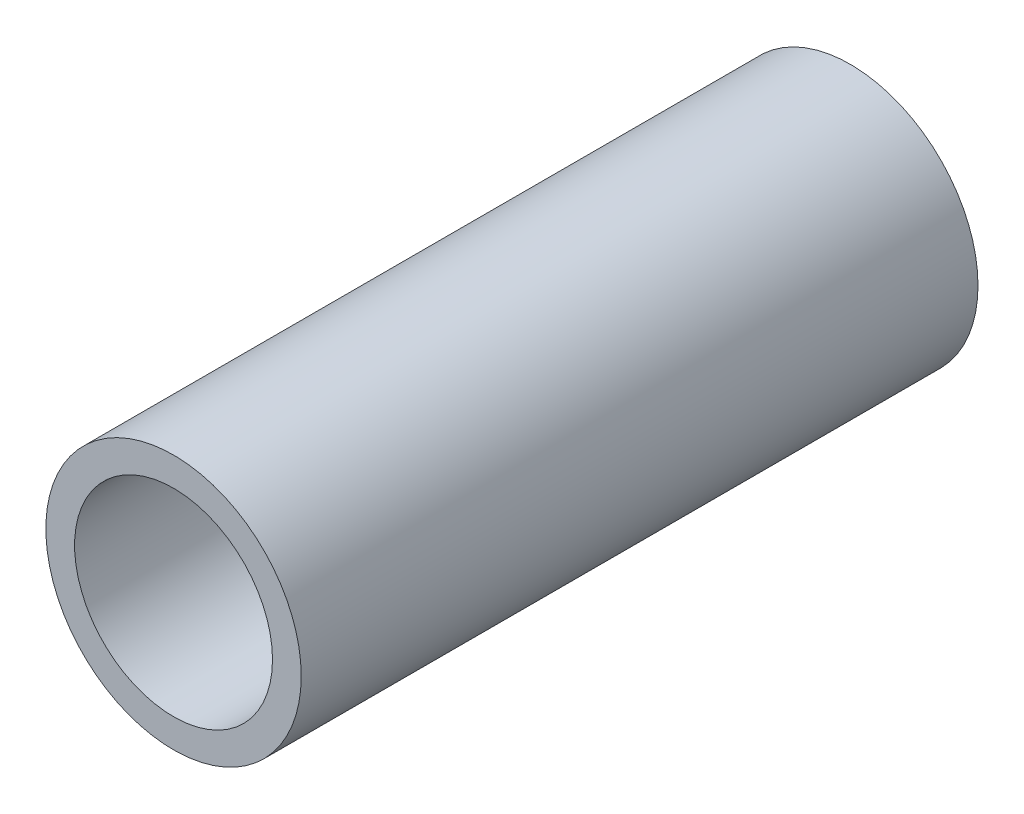
ISO-10303-21;
HEADER;
FILE_DESCRIPTION(('STEP AP214'),'2;1');
FILE_NAME('part.step','',(''),(''),'','','');
FILE_SCHEMA(('AUTOMOTIVE_DESIGN { 1 0 10303 214 1 1 1 1 }'));
ENDSEC;
DATA;
#1=APPLICATION_CONTEXT('core data for automotive mechanical design processes');
#2=APPLICATION_PROTOCOL_DEFINITION('international standard','automotive_design',2000,#1);
#3=PRODUCT_CONTEXT('',#1,'mechanical');
#4=PRODUCT('Part','Part','',(#3));
#5=PRODUCT_RELATED_PRODUCT_CATEGORY('part','',(#4));
#6=PRODUCT_DEFINITION_FORMATION('','',#4);
#7=PRODUCT_DEFINITION_CONTEXT('part definition',#1,'design');
#8=PRODUCT_DEFINITION('design','',#6,#7);
#9=PRODUCT_DEFINITION_SHAPE('','',#8);
#10=(LENGTH_UNIT() NAMED_UNIT(*) SI_UNIT(.MILLI.,.METRE.));
#11=(NAMED_UNIT(*) PLANE_ANGLE_UNIT() SI_UNIT($,.RADIAN.));
#12=(NAMED_UNIT(*) SI_UNIT($,.STERADIAN.) SOLID_ANGLE_UNIT());
#13=UNCERTAINTY_MEASURE_WITH_UNIT(LENGTH_MEASURE(1.E-05),#10,'distance_accuracy_value','');
#14=(GEOMETRIC_REPRESENTATION_CONTEXT(3) GLOBAL_UNCERTAINTY_ASSIGNED_CONTEXT((#13)) GLOBAL_UNIT_ASSIGNED_CONTEXT((#10,
#11,#12)) REPRESENTATION_CONTEXT('',''));
#15=CARTESIAN_POINT('',(0.,0.,0.));
#16=DIRECTION('',(0.,0.,1.));
#17=DIRECTION('',(1.,0.,0.));
#18=AXIS2_PLACEMENT_3D('',#15,#16,#17);
#19=CARTESIAN_POINT('',(0.,0.,5.3));
#20=DIRECTION('',(0.,0.,1.));
#21=DIRECTION('',(1.,0.,0.));
#22=AXIS2_PLACEMENT_3D('',#19,#20,#21);
#23=PLANE('',#22);
#24=CARTESIAN_POINT('',(0.,0.,5.3));
#25=DIRECTION('',(0.,0.,1.));
#26=DIRECTION('',(1.,0.,0.));
#27=AXIS2_PLACEMENT_3D('',#24,#25,#26);
#28=CIRCLE('',#27,1.);
#29=CARTESIAN_POINT('',(1.,0.,5.3));
#30=VERTEX_POINT('',#29);
#31=EDGE_CURVE('E10',#30,#30,#28,.T.);
#32=ORIENTED_EDGE('',*,*,#31,.T.);
#33=EDGE_LOOP('',(#32));
#34=FACE_BOUND('',#33,.T.);
#35=CARTESIAN_POINT('',(0.,0.,5.3));
#36=DIRECTION('',(0.,0.,1.));
#37=DIRECTION('',(1.,0.,0.));
#38=AXIS2_PLACEMENT_3D('',#35,#36,#37);
#39=CIRCLE('',#38,0.775);
#40=CARTESIAN_POINT('',(0.775,0.,5.3));
#41=VERTEX_POINT('',#40);
#42=EDGE_CURVE('E46',#41,#41,#39,.T.);
#43=ORIENTED_EDGE('',*,*,#42,.F.);
#44=EDGE_LOOP('',(#43));
#45=FACE_BOUND('',#44,.T.);
#46=ADVANCED_FACE('F35',(#34,#45),#23,.T.);
#47=CARTESIAN_POINT('',(0.,0.,0.));
#48=DIRECTION('',(0.,0.,1.));
#49=DIRECTION('',(1.,0.,0.));
#50=AXIS2_PLACEMENT_3D('',#47,#48,#49);
#51=PLANE('',#50);
#52=CARTESIAN_POINT('',(0.,0.,0.));
#53=DIRECTION('',(0.,0.,1.));
#54=DIRECTION('',(1.,0.,0.));
#55=AXIS2_PLACEMENT_3D('',#52,#53,#54);
#56=CIRCLE('',#55,1.);
#57=CARTESIAN_POINT('',(1.,0.,0.));
#58=VERTEX_POINT('',#57);
#59=EDGE_CURVE('E39',#58,#58,#56,.T.);
#60=ORIENTED_EDGE('',*,*,#59,.F.);
#61=EDGE_LOOP('',(#60));
#62=FACE_BOUND('',#61,.T.);
#63=CARTESIAN_POINT('',(0.,0.,0.));
#64=DIRECTION('',(0.,0.,1.));
#65=DIRECTION('',(1.,0.,0.));
#66=AXIS2_PLACEMENT_3D('',#63,#64,#65);
#67=CIRCLE('',#66,0.775);
#68=CARTESIAN_POINT('',(0.775,0.,0.));
#69=VERTEX_POINT('',#68);
#70=EDGE_CURVE('E48',#69,#69,#67,.T.);
#71=ORIENTED_EDGE('',*,*,#70,.T.);
#72=EDGE_LOOP('',(#71));
#73=FACE_BOUND('',#72,.T.);
#74=ADVANCED_FACE('F58',(#62,#73),#51,.F.);
#75=CARTESIAN_POINT('',(0.,0.,5.3));
#76=DIRECTION('',(0.,0.,-1.));
#77=DIRECTION('',(-1.,0.,0.));
#78=AXIS2_PLACEMENT_3D('',#75,#76,#77);
#79=CYLINDRICAL_SURFACE('',#78,1.);
#80=ORIENTED_EDGE('',*,*,#31,.F.);
#81=EDGE_LOOP('',(#80));
#82=FACE_BOUND('',#81,.T.);
#83=ORIENTED_EDGE('',*,*,#59,.T.);
#84=EDGE_LOOP('',(#83));
#85=FACE_BOUND('',#84,.T.);
#86=ADVANCED_FACE('F37',(#82,#85),#79,.T.);
#87=CARTESIAN_POINT('',(0.,0.,5.3));
#88=DIRECTION('',(0.,0.,-1.));
#89=DIRECTION('',(-1.,0.,0.));
#90=AXIS2_PLACEMENT_3D('',#87,#88,#89);
#91=CYLINDRICAL_SURFACE('',#90,0.775);
#92=ORIENTED_EDGE('',*,*,#42,.T.);
#93=EDGE_LOOP('',(#92));
#94=FACE_BOUND('',#93,.T.);
#95=ORIENTED_EDGE('',*,*,#70,.F.);
#96=EDGE_LOOP('',(#95));
#97=FACE_BOUND('',#96,.T.);
#98=ADVANCED_FACE('F54',(#94,#97),#91,.F.);
#99=CLOSED_SHELL('',(#46,#74,#86,#98));
#100=MANIFOLD_SOLID_BREP('B2',#99);
#101=ADVANCED_BREP_SHAPE_REPRESENTATION('',(#18,#100),#14);
#102=SHAPE_DEFINITION_REPRESENTATION(#9,#101);
ENDSEC;
END-ISO-10303-21;
